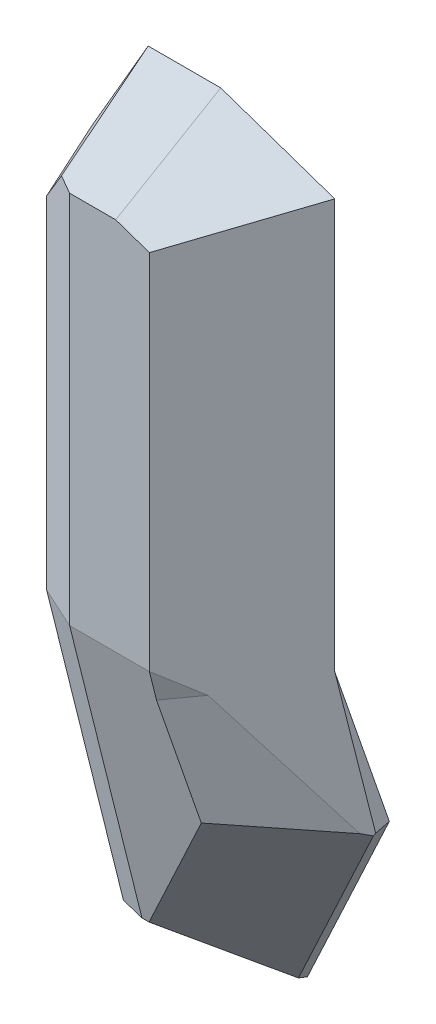
ISO-10303-21;
HEADER;
FILE_DESCRIPTION(('STEP AP214'),'2;1');
FILE_NAME('part.step','',(''),(''),'','','');
FILE_SCHEMA(('AUTOMOTIVE_DESIGN { 1 0 10303 214 1 1 1 1 }'));
ENDSEC;
DATA;
#1=APPLICATION_CONTEXT('core data for automotive mechanical design processes');
#2=APPLICATION_PROTOCOL_DEFINITION('international standard','automotive_design',2000,#1);
#3=PRODUCT_CONTEXT('',#1,'mechanical');
#4=PRODUCT('Part','Part','',(#3));
#5=PRODUCT_RELATED_PRODUCT_CATEGORY('part','',(#4));
#6=PRODUCT_DEFINITION_FORMATION('','',#4);
#7=PRODUCT_DEFINITION_CONTEXT('part definition',#1,'design');
#8=PRODUCT_DEFINITION('design','',#6,#7);
#9=PRODUCT_DEFINITION_SHAPE('','',#8);
#10=(LENGTH_UNIT() NAMED_UNIT(*) SI_UNIT(.MILLI.,.METRE.));
#11=(NAMED_UNIT(*) PLANE_ANGLE_UNIT() SI_UNIT($,.RADIAN.));
#12=(NAMED_UNIT(*) SI_UNIT($,.STERADIAN.) SOLID_ANGLE_UNIT());
#13=UNCERTAINTY_MEASURE_WITH_UNIT(LENGTH_MEASURE(1.E-05),#10,'distance_accuracy_value','');
#14=(GEOMETRIC_REPRESENTATION_CONTEXT(3) GLOBAL_UNCERTAINTY_ASSIGNED_CONTEXT((#13)) GLOBAL_UNIT_ASSIGNED_CONTEXT((#10,
#11,#12)) REPRESENTATION_CONTEXT('',''));
#15=CARTESIAN_POINT('',(0.,0.,0.));
#16=DIRECTION('',(0.,0.,1.));
#17=DIRECTION('',(1.,0.,0.));
#18=AXIS2_PLACEMENT_3D('',#15,#16,#17);
#19=CARTESIAN_POINT('',(0.,0.,10.));
#20=DIRECTION('',(0.,0.,1.));
#21=DIRECTION('',(1.,0.,0.));
#22=AXIS2_PLACEMENT_3D('',#19,#20,#21);
#23=PLANE('',#22);
#24=DIRECTION('',(-1.,0.,0.));
#25=VECTOR('',#24,1.);
#26=CARTESIAN_POINT('',(16.3625553019653,20.4199984097109,10.));
#27=LINE('',#26,#25);
#28=CARTESIAN_POINT('',(22.8583379716761,20.4199984097109,10.));
#29=VERTEX_POINT('',#28);
#30=CARTESIAN_POINT('',(17.8796509543944,20.4199984097109,10.));
#31=VERTEX_POINT('',#30);
#32=EDGE_CURVE('E214',#29,#31,#27,.T.);
#33=ORIENTED_EDGE('',*,*,#32,.T.);
#34=DIRECTION('',(0.,-1.,0.));
#35=VECTOR('',#34,1.);
#36=CARTESIAN_POINT('',(17.8796509543944,0.,10.));
#37=LINE('',#36,#35);
#38=CARTESIAN_POINT('',(17.8796509543944,-20.,10.));
#39=VERTEX_POINT('',#38);
#40=EDGE_CURVE('E205',#31,#39,#37,.T.);
#41=ORIENTED_EDGE('',*,*,#40,.T.);
#42=DIRECTION('',(1.,0.,0.));
#43=VECTOR('',#42,1.);
#44=CARTESIAN_POINT('',(0.,-20.,10.));
#45=LINE('',#44,#43);
#46=CARTESIAN_POINT('',(26.4999999999999,-20.,10.));
#47=VERTEX_POINT('',#46);
#48=EDGE_CURVE('E166',#39,#47,#45,.T.);
#49=ORIENTED_EDGE('',*,*,#48,.T.);
#50=DIRECTION('',(0.,1.,0.));
#51=VECTOR('',#50,1.);
#52=CARTESIAN_POINT('',(26.5,15.742857142857,10.));
#53=LINE('',#52,#51);
#54=CARTESIAN_POINT('',(26.5,19.1714285714285,10.));
#55=VERTEX_POINT('',#54);
#56=EDGE_CURVE('E176',#47,#55,#53,.T.);
#57=ORIENTED_EDGE('',*,*,#56,.T.);
#58=DIRECTION('',(-0.945945945945946,0.324324324324324,0.));
#59=VECTOR('',#58,1.);
#60=CARTESIAN_POINT('',(21.5970767104149,20.8524308421433,10.));
#61=LINE('',#60,#59);
#62=EDGE_CURVE('E418',#55,#29,#61,.T.);
#63=ORIENTED_EDGE('',*,*,#62,.T.);
#64=EDGE_LOOP('',(#33,#41,#49,#57,#63));
#65=FACE_BOUND('',#64,.T.);
#66=ADVANCED_FACE('F33',(#65),#23,.T.);
#67=CARTESIAN_POINT('',(0.,0.,0.));
#68=DIRECTION('',(0.,0.,1.));
#69=DIRECTION('',(1.,0.,0.));
#70=AXIS2_PLACEMENT_3D('',#67,#68,#69);
#71=PLANE('',#70);
#72=DIRECTION('',(1.,0.,0.));
#73=VECTOR('',#72,1.);
#74=CARTESIAN_POINT('',(0.,-20.,0.));
#75=LINE('',#74,#73);
#76=CARTESIAN_POINT('',(10.4089710823901,-20.,0.));
#77=VERTEX_POINT('',#76);
#78=CARTESIAN_POINT('',(36.5,-20.,0.));
#79=VERTEX_POINT('',#78);
#80=EDGE_CURVE('E136',#77,#79,#75,.T.);
#81=ORIENTED_EDGE('',*,*,#80,.F.);
#82=DIRECTION('',(-0.096560909917053,0.995327077234409,0.));
#83=VECTOR('',#82,1.);
#84=CARTESIAN_POINT('',(8.36563373946713,1.06223923410054,0.));
#85=LINE('',#84,#83);
#86=CARTESIAN_POINT('',(10.2895410829714,-18.7689437438234,0.));
#87=VERTEX_POINT('',#86);
#88=EDGE_CURVE('E191',#77,#87,#85,.T.);
#89=ORIENTED_EDGE('',*,*,#88,.T.);
#90=DIRECTION('',(0.,-1.,0.));
#91=VECTOR('',#90,1.);
#92=CARTESIAN_POINT('',(10.2895410829714,0.,0.));
#93=LINE('',#92,#91);
#94=CARTESIAN_POINT('',(10.2895410829714,17.9510749687993,0.));
#95=VERTEX_POINT('',#94);
#96=EDGE_CURVE('E149',#95,#87,#93,.T.);
#97=ORIENTED_EDGE('',*,*,#96,.F.);
#98=DIRECTION('',(-0.501782302817981,-0.864993942509821,0.));
#99=VECTOR('',#98,1.);
#100=CARTESIAN_POINT('',(-0.0926763401503869,0.053761471719066,0.));
#101=LINE('',#100,#99);
#102=CARTESIAN_POINT('',(16.3625553019653,28.4199984097109,0.));
#103=VERTEX_POINT('',#102);
#104=EDGE_CURVE('E243',#103,#95,#101,.T.);
#105=ORIENTED_EDGE('',*,*,#104,.F.);
#106=DIRECTION('',(-1.,0.,0.));
#107=VECTOR('',#106,1.);
#108=CARTESIAN_POINT('',(0.,28.4199984097109,0.));
#109=LINE('',#108,#107);
#110=CARTESIAN_POINT('',(24.1916713050095,28.4199984097109,0.));
#111=VERTEX_POINT('',#110);
#112=EDGE_CURVE('E247',#111,#103,#109,.T.);
#113=ORIENTED_EDGE('',*,*,#112,.F.);
#114=DIRECTION('',(-0.945945945945946,0.324324324324324,0.));
#115=VECTOR('',#114,1.);
#116=CARTESIAN_POINT('',(11.263696128561,32.8524470416361,0.));
#117=LINE('',#116,#115);
#118=CARTESIAN_POINT('',(36.5,24.1999999999999,0.));
#119=VERTEX_POINT('',#118);
#120=EDGE_CURVE('E164',#119,#111,#117,.T.);
#121=ORIENTED_EDGE('',*,*,#120,.F.);
#122=DIRECTION('',(0.,1.,0.));
#123=VECTOR('',#122,1.);
#124=CARTESIAN_POINT('',(36.5,0.,0.));
#125=LINE('',#124,#123);
#126=EDGE_CURVE('E148',#79,#119,#125,.T.);
#127=ORIENTED_EDGE('',*,*,#126,.F.);
#128=EDGE_LOOP('',(#81,#89,#97,#105,#113,#121,#127));
#129=FACE_BOUND('',#128,.T.);
#130=ADVANCED_FACE('F162',(#129),#71,.F.);
#131=CARTESIAN_POINT('',(38.711509495044,-20.,10.));
#132=DIRECTION('',(0.,-0.242535625036333,0.970142500145332));
#133=DIRECTION('',(0.,-0.970142500145332,-0.242535625036333));
#134=AXIS2_PLACEMENT_3D('',#131,#132,#133);
#135=PLANE('',#134);
#136=ORIENTED_EDGE('',*,*,#48,.F.);
#137=DIRECTION('',(0.,-0.970142500145332,-0.242535625036333));
#138=VECTOR('',#137,1.);
#139=CARTESIAN_POINT('',(17.8796509543944,-20.,10.));
#140=LINE('',#139,#138);
#141=CARTESIAN_POINT('',(17.8796509543944,-51.2541398446393,2.18646503884018));
#142=VERTEX_POINT('',#141);
#143=EDGE_CURVE('E193',#39,#142,#140,.T.);
#144=ORIENTED_EDGE('',*,*,#143,.T.);
#145=DIRECTION('',(-1.,0.,0.));
#146=VECTOR('',#145,1.);
#147=CARTESIAN_POINT('',(38.711509495044,-51.2541398446393,2.18646503884018));
#148=LINE('',#147,#146);
#149=CARTESIAN_POINT('',(18.6460740663521,-51.2541398446393,2.18646503884018));
#150=VERTEX_POINT('',#149);
#151=EDGE_CURVE('E237',#150,#142,#148,.T.);
#152=ORIENTED_EDGE('',*,*,#151,.F.);
#153=DIRECTION('',(0.503066169780382,0.838443616300638,0.209610904075159));
#154=VECTOR('',#153,1.);
#155=CARTESIAN_POINT('',(30.069030517213,-32.2158790932045,6.94603022669886));
#156=LINE('',#155,#154);
#157=CARTESIAN_POINT('',(28.3130965277123,-35.1424357423723,6.21439106440692));
#158=VERTEX_POINT('',#157);
#159=EDGE_CURVE('E414',#150,#158,#156,.T.);
#160=ORIENTED_EDGE('',*,*,#159,.T.);
#161=DIRECTION('',(-0.144004608221195,0.960030721474639,0.24000768036866));
#162=VECTOR('',#161,1.);
#163=CARTESIAN_POINT('',(26.6042298288053,-23.7499910829922,9.06250222925195));
#164=LINE('',#163,#162);
#165=CARTESIAN_POINT('',(26.4999999999999,-23.0551255576232,9.23621861059419));
#166=VERTEX_POINT('',#165);
#167=EDGE_CURVE('E412',#158,#166,#164,.T.);
#168=ORIENTED_EDGE('',*,*,#167,.T.);
#169=DIRECTION('',(0.,0.970142500145332,0.242535625036333));
#170=VECTOR('',#169,1.);
#171=CARTESIAN_POINT('',(26.4999999999999,-20.,10.));
#172=LINE('',#171,#170);
#173=EDGE_CURVE('E226',#166,#47,#172,.T.);
#174=ORIENTED_EDGE('',*,*,#173,.T.);
#175=EDGE_LOOP('',(#136,#144,#152,#160,#168,#174));
#176=FACE_BOUND('',#175,.T.);
#177=ADVANCED_FACE('F220',(#176),#135,.T.);
#178=CARTESIAN_POINT('',(38.711509495044,-60.,-10.));
#179=DIRECTION('',(0.,-0.812431002589345,0.583057343690714));
#180=DIRECTION('',(0.,-0.583057343690714,-0.812431002589345));
#181=AXIS2_PLACEMENT_3D('',#178,#179,#180);
#182=PLANE('',#181);
#183=ORIENTED_EDGE('',*,*,#151,.T.);
#184=DIRECTION('',(0.833595497575741,0.322066514389543,0.448766873477113));
#185=VECTOR('',#184,1.);
#186=CARTESIAN_POINT('',(25.4484588103233,-48.3298683348574,6.26113944307136));
#187=LINE('',#186,#185);
#188=CARTESIAN_POINT('',(13.5467597302632,-52.9281882024379,-0.146150784331431));
#189=VERTEX_POINT('',#188);
#190=EDGE_CURVE('E201',#142,#189,#187,.F.);
#191=ORIENTED_EDGE('',*,*,#190,.T.);
#192=DIRECTION('',(-0.250459024806615,-0.564473674042357,-0.786536552364887));
#193=VECTOR('',#192,1.);
#194=CARTESIAN_POINT('',(12.1843814802434,-55.9986571416899,-4.42453641094181));
#195=LINE('',#194,#193);
#196=CARTESIAN_POINT('',(10.4089710823901,-60.,-10.));
#197=VERTEX_POINT('',#196);
#198=EDGE_CURVE('E188',#189,#197,#195,.T.);
#199=ORIENTED_EDGE('',*,*,#198,.T.);
#200=DIRECTION('',(-1.,0.,0.));
#201=VECTOR('',#200,1.);
#202=CARTESIAN_POINT('',(38.711509495044,-60.,-10.));
#203=LINE('',#202,#201);
#204=CARTESIAN_POINT('',(23.55754747522,-60.,-10.));
#205=VERTEX_POINT('',#204);
#206=EDGE_CURVE('E430',#205,#197,#203,.T.);
#207=ORIENTED_EDGE('',*,*,#206,.F.);
#208=DIRECTION('',(-0.405762629335767,-0.532901873265707,-0.742544464732197));
#209=VECTOR('',#208,1.);
#210=CARTESIAN_POINT('',(26.0525459624705,-56.7232335569507,-5.43415982083954));
#211=LINE('',#210,#209);
#212=CARTESIAN_POINT('',(24.7254446492524,-58.4661608861259,-7.86275147276681));
#213=VERTEX_POINT('',#212);
#214=EDGE_CURVE('E432',#213,#205,#211,.T.);
#215=ORIENTED_EDGE('',*,*,#214,.F.);
#216=DIRECTION('',(-0.441091785473617,0.523271808270817,0.729125950338271));
#217=VECTOR('',#216,1.);
#218=CARTESIAN_POINT('',(28.4879912985251,-62.9297094120959,-14.0822515670553));
#219=LINE('',#218,#217);
#220=EDGE_CURVE('E407',#213,#150,#219,.T.);
#221=ORIENTED_EDGE('',*,*,#220,.T.);
#222=EDGE_LOOP('',(#183,#191,#199,#207,#215,#221));
#223=FACE_BOUND('',#222,.T.);
#224=ADVANCED_FACE('F235',(#223),#182,.T.);
#225=CARTESIAN_POINT('',(38.711509495044,-20.,0.));
#226=DIRECTION('',(0.,0.242535625036333,-0.970142500145332));
#227=DIRECTION('',(0.,0.970142500145332,0.242535625036333));
#228=AXIS2_PLACEMENT_3D('',#225,#226,#227);
#229=PLANE('',#228);
#230=ORIENTED_EDGE('',*,*,#206,.T.);
#231=DIRECTION('',(0.,0.970142500145332,0.242535625036333));
#232=VECTOR('',#231,1.);
#233=CARTESIAN_POINT('',(10.4089710823901,-20.,0.));
#234=LINE('',#233,#232);
#235=EDGE_CURVE('E144',#197,#77,#234,.T.);
#236=ORIENTED_EDGE('',*,*,#235,.T.);
#237=ORIENTED_EDGE('',*,*,#80,.T.);
#238=DIRECTION('',(-0.144004608221195,0.960030721474639,0.24000768036866));
#239=VECTOR('',#238,1.);
#240=CARTESIAN_POINT('',(32.9781105990783,3.47926267281104,5.86981566820276));
#241=LINE('',#240,#239);
#242=CARTESIAN_POINT('',(38.711509495044,-34.7433966336267,-3.68584915840669));
#243=VERTEX_POINT('',#242);
#244=EDGE_CURVE('E141',#243,#79,#241,.T.);
#245=ORIENTED_EDGE('',*,*,#244,.F.);
#246=DIRECTION('',(0.503066169780382,0.838443616300638,0.209610904075159));
#247=VECTOR('',#246,1.);
#248=CARTESIAN_POINT('',(43.9577463567109,-25.9996685308484,-1.49991713271212));
#249=LINE('',#248,#247);
#250=EDGE_CURVE('E157',#205,#243,#249,.T.);
#251=ORIENTED_EDGE('',*,*,#250,.F.);
#252=EDGE_LOOP('',(#230,#236,#237,#245,#251));
#253=FACE_BOUND('',#252,.T.);
#254=ADVANCED_FACE('F139',(#253),#229,.T.);
#255=CARTESIAN_POINT('',(43.9577463567109,-28.4250247812118,8.2015078687412));
#256=DIRECTION('',(-0.864247897783094,0.488045871689275,0.122011467922319));
#257=DIRECTION('',(-0.491719661409982,-0.870753567080177,0.));
#258=AXIS2_PLACEMENT_3D('',#255,#256,#257);
#259=PLANE('',#258);
#260=DIRECTION('',(0.,-0.242535625036333,0.970142500145332));
#261=VECTOR('',#260,1.);
#262=CARTESIAN_POINT('',(38.711509495044,-33.5669260453914,-8.39173151134784));
#263=LINE('',#262,#261);
#264=CARTESIAN_POINT('',(38.711509495044,-35.1119815494673,-2.21150949504404));
#265=VERTEX_POINT('',#264);
#266=EDGE_CURVE('E156',#243,#265,#263,.T.);
#267=ORIENTED_EDGE('',*,*,#266,.T.);
#268=DIRECTION('',(-0.405427964256693,-0.819302344435402,0.405427964256694));
#269=VECTOR('',#268,1.);
#270=CARTESIAN_POINT('',(46.3601326199036,-19.6553889846469,-9.86013261990365));
#271=LINE('',#270,#269);
#272=CARTESIAN_POINT('',(38.5870729952625,-35.363446976109,-2.08707299526258));
#273=VERTEX_POINT('',#272);
#274=EDGE_CURVE('E171',#265,#273,#271,.T.);
#275=ORIENTED_EDGE('',*,*,#274,.T.);
#276=DIRECTION('',(-0.503066169780382,-0.838443616300638,-0.209610904075159));
#277=VECTOR('',#276,1.);
#278=CARTESIAN_POINT('',(30.2168282743188,-49.3138548443486,-5.57467496232248));
#279=LINE('',#278,#277);
#280=EDGE_CURVE('E405',#273,#213,#279,.T.);
#281=ORIENTED_EDGE('',*,*,#280,.T.);
#282=ORIENTED_EDGE('',*,*,#214,.T.);
#283=ORIENTED_EDGE('',*,*,#250,.T.);
#284=EDGE_LOOP('',(#267,#275,#281,#282,#283));
#285=FACE_BOUND('',#284,.T.);
#286=ADVANCED_FACE('F357',(#285),#259,.F.);
#287=CARTESIAN_POINT('',(32.9781105990783,1.05390642244771,15.5712406696561));
#288=DIRECTION('',(-0.989577017119466,-0.139704990652159,-0.0349262476630398));
#289=DIRECTION('',(0.13979027774953,-0.990181134059173,0.));
#290=AXIS2_PLACEMENT_3D('',#287,#288,#289);
#291=PLANE('',#290);
#292=ORIENTED_EDGE('',*,*,#244,.T.);
#293=DIRECTION('',(0.143304653157729,-0.979248463244485,-0.143304653157729));
#294=VECTOR('',#293,1.);
#295=CARTESIAN_POINT('',(33.282658300057,1.98516828294352,3.21734169994292));
#296=LINE('',#295,#294);
#297=EDGE_CURVE('E154',#79,#265,#296,.T.);
#298=ORIENTED_EDGE('',*,*,#297,.T.);
#299=ORIENTED_EDGE('',*,*,#266,.F.);
#300=EDGE_LOOP('',(#292,#298,#299));
#301=FACE_BOUND('',#300,.T.);
#302=ADVANCED_FACE('F152',(#301),#291,.F.);
#303=CARTESIAN_POINT('',(36.5,0.763814412055373,6.94474235177851));
#304=DIRECTION('',(0.624695047554423,-0.189388504769643,0.757554019078571));
#305=DIRECTION('',(0.,0.970142500145332,0.242535625036333));
#306=AXIS2_PLACEMENT_3D('',#303,#304,#305);
#307=PLANE('',#306);
#308=DIRECTION('',(0.779624591261606,0.206013411142903,-0.591391554834392));
#309=VECTOR('',#308,1.);
#310=CARTESIAN_POINT('',(35.4240650457465,-20.6969686934839,2.46678526792994));
#311=LINE('',#310,#309);
#312=CARTESIAN_POINT('',(29.6634338202847,-22.2191978565908,6.83656617971526));
#313=VERTEX_POINT('',#312);
#314=EDGE_CURVE('E158',#313,#166,#311,.F.);
#315=ORIENTED_EDGE('',*,*,#314,.F.);
#316=DIRECTION('',(-0.633454136612263,0.444377895059624,0.633454136612265));
#317=VECTOR('',#316,1.);
#318=CARTESIAN_POINT('',(25.8937380350674,-19.5746978348388,10.6062619649326));
#319=LINE('',#318,#317);
#320=EDGE_CURVE('E183',#313,#47,#319,.T.);
#321=ORIENTED_EDGE('',*,*,#320,.T.);
#322=ORIENTED_EDGE('',*,*,#173,.F.);
#323=EDGE_LOOP('',(#315,#321,#322));
#324=FACE_BOUND('',#323,.T.);
#325=ADVANCED_FACE('F275',(#324),#307,.T.);
#326=CARTESIAN_POINT('',(32.9781105990783,3.06660649663112,7.52044037292244));
#327=DIRECTION('',(0.618183861768209,-0.102115488990602,0.779372273023331));
#328=DIRECTION('',(-0.144004608221195,0.960030721474639,0.24000768036866));
#329=AXIS2_PLACEMENT_3D('',#326,#327,#328);
#330=PLANE('',#329);
#331=DIRECTION('',(0.783401951992458,-0.00102589089719062,-0.621514544610401));
#332=VECTOR('',#331,1.);
#333=CARTESIAN_POINT('',(30.5094846848295,-35.1453119856742,4.47187921364305));
#334=LINE('',#333,#332);
#335=CARTESIAN_POINT('',(37.8584348319835,-35.1549356801783,-1.35843483198354));
#336=VERTEX_POINT('',#335);
#337=EDGE_CURVE('E420',#336,#158,#334,.F.);
#338=ORIENTED_EDGE('',*,*,#337,.F.);
#339=DIRECTION('',(-0.471843287766038,0.74480052603383,0.471843287766039));
#340=VECTOR('',#339,1.);
#341=CARTESIAN_POINT('',(21.3629772185519,-9.11699930130058,15.1370227814481));
#342=LINE('',#341,#340);
#343=EDGE_CURVE('E181',#336,#313,#342,.T.);
#344=ORIENTED_EDGE('',*,*,#343,.T.);
#345=ORIENTED_EDGE('',*,*,#314,.T.);
#346=ORIENTED_EDGE('',*,*,#167,.F.);
#347=EDGE_LOOP('',(#338,#344,#345,#346));
#348=FACE_BOUND('',#347,.T.);
#349=ADVANCED_FACE('F271',(#348),#330,.T.);
#350=CARTESIAN_POINT('',(43.9577463567109,-26.4123247070284,0.150707572007573));
#351=DIRECTION('',(0.53989138160442,-0.494268343793314,0.681334059322653));
#352=DIRECTION('',(0.503066169780382,0.838443616300638,0.209610904075159));
#353=AXIS2_PLACEMENT_3D('',#350,#351,#352);
#354=PLANE('',#353);
#355=ORIENTED_EDGE('',*,*,#280,.F.);
#356=DIRECTION('',(-0.69306030029259,0.198330129624041,0.693060300292591));
#357=VECTOR('',#356,1.);
#358=CARTESIAN_POINT('',(38.8615292964646,-35.441986972947,-2.36152929646471));
#359=LINE('',#358,#357);
#360=EDGE_CURVE('E174',#273,#336,#359,.T.);
#361=ORIENTED_EDGE('',*,*,#360,.T.);
#362=ORIENTED_EDGE('',*,*,#337,.T.);
#363=ORIENTED_EDGE('',*,*,#159,.F.);
#364=ORIENTED_EDGE('',*,*,#220,.F.);
#365=EDGE_LOOP('',(#355,#361,#362,#363,#364));
#366=FACE_BOUND('',#365,.T.);
#367=ADVANCED_FACE('F267',(#366),#354,.T.);
#368=CARTESIAN_POINT('',(0.,20.4199984097109,10.));
#369=DIRECTION('',(0.,0.78086880944303,0.624695047554424));
#370=DIRECTION('',(1.,0.,0.));
#371=AXIS2_PLACEMENT_3D('',#368,#369,#370);
#372=PLANE('',#371);
#373=DIRECTION('',(-0.00128717065701618,-0.62469453005424,0.7808681625678));
#374=VECTOR('',#373,1.);
#375=CARTESIAN_POINT('',(16.3460443787399,20.4068547221408,10.0164296094626));
#376=LINE('',#375,#374);
#377=CARTESIAN_POINT('',(16.347154093952,20.9454259047197,9.34321563123899));
#378=VERTEX_POINT('',#377);
#379=EDGE_CURVE('E186',#103,#378,#376,.T.);
#380=ORIENTED_EDGE('',*,*,#379,.T.);
#381=DIRECTION('',(-0.876645253724841,0.300564086991377,-0.375705108739221));
#382=VECTOR('',#381,1.);
#383=CARTESIAN_POINT('',(4.13901581064719,25.1310733161386,4.11115636696545));
#384=LINE('',#383,#382);
#385=EDGE_CURVE('E11',#378,#31,#384,.F.);
#386=ORIENTED_EDGE('',*,*,#385,.T.);
#387=ORIENTED_EDGE('',*,*,#32,.F.);
#388=DIRECTION('',(0.1035560746157,0.621336447694197,-0.776670559617747));
#389=VECTOR('',#388,1.);
#390=CARTESIAN_POINT('',(22.613208341953,18.9492206313725,11.838472222923));
#391=LINE('',#390,#389);
#392=EDGE_CURVE('E198',#111,#29,#391,.F.);
#393=ORIENTED_EDGE('',*,*,#392,.F.);
#394=ORIENTED_EDGE('',*,*,#112,.T.);
#395=EDGE_LOOP('',(#380,#386,#387,#393,#394));
#396=FACE_BOUND('',#395,.T.);
#397=ADVANCED_FACE('F270',(#396),#372,.T.);
#398=CARTESIAN_POINT('',(8.66910153396635,25.2848794740685,10.));
#399=DIRECTION('',(0.25325474900855,0.738659684608272,0.624695047554424));
#400=DIRECTION('',(0.945945945945946,-0.324324324324324,0.));
#401=AXIS2_PLACEMENT_3D('',#398,#399,#400);
#402=PLANE('',#401);
#403=ORIENTED_EDGE('',*,*,#62,.F.);
#404=DIRECTION('',(0.666242581872043,0.335024841169943,-0.666242581872045));
#405=VECTOR('',#404,1.);
#406=CARTESIAN_POINT('',(19.9498054668287,15.8776164633194,16.5501945331713));
#407=LINE('',#406,#405);
#408=EDGE_CURVE('E172',#55,#119,#407,.T.);
#409=ORIENTED_EDGE('',*,*,#408,.T.);
#410=ORIENTED_EDGE('',*,*,#120,.T.);
#411=ORIENTED_EDGE('',*,*,#392,.T.);
#412=EDGE_LOOP('',(#403,#409,#410,#411));
#413=FACE_BOUND('',#412,.T.);
#414=ADVANCED_FACE('F280',(#413),#402,.T.);
#415=CARTESIAN_POINT('',(26.5,0.,10.));
#416=DIRECTION('',(0.707106781186549,0.,0.707106781186547));
#417=DIRECTION('',(0.,-1.,0.));
#418=AXIS2_PLACEMENT_3D('',#415,#416,#417);
#419=PLANE('',#418);
#420=ORIENTED_EDGE('',*,*,#297,.F.);
#421=ORIENTED_EDGE('',*,*,#126,.T.);
#422=ORIENTED_EDGE('',*,*,#408,.F.);
#423=ORIENTED_EDGE('',*,*,#56,.F.);
#424=ORIENTED_EDGE('',*,*,#320,.F.);
#425=ORIENTED_EDGE('',*,*,#343,.F.);
#426=ORIENTED_EDGE('',*,*,#360,.F.);
#427=ORIENTED_EDGE('',*,*,#274,.F.);
#428=EDGE_LOOP('',(#420,#421,#422,#423,#424,#425,#426,#427));
#429=FACE_BOUND('',#428,.T.);
#430=ADVANCED_FACE('F169',(#429),#419,.T.);
#431=CARTESIAN_POINT('',(10.2895410829714,1.24888566212805,5.00445735148778));
#432=DIRECTION('',(-0.92847669088526,-0.0900754698222086,0.360301879288834));
#433=DIRECTION('',(0.,-0.970142500145332,-0.242535625036333));
#434=AXIS2_PLACEMENT_3D('',#431,#432,#433);
#435=PLANE('',#434);
#436=ORIENTED_EDGE('',*,*,#198,.F.);
#437=DIRECTION('',(0.,0.970142500145332,0.242535625036333));
#438=VECTOR('',#437,1.);
#439=CARTESIAN_POINT('',(13.5467597302632,-0.726093239124246,12.904372956497));
#440=LINE('',#439,#438);
#441=CARTESIAN_POINT('',(13.5467597302632,-19.7713985921943,8.14304661822947));
#442=VERTEX_POINT('',#441);
#443=EDGE_CURVE('E203',#189,#442,#440,.T.);
#444=ORIENTED_EDGE('',*,*,#443,.T.);
#445=DIRECTION('',(0.368988147273833,-0.113561291789115,0.922470368184589));
#446=VECTOR('',#445,1.);
#447=CARTESIAN_POINT('',(13.4514856697856,-19.7420766601437,7.90486146703554));
#448=LINE('',#447,#446);
#449=EDGE_CURVE('E196',#87,#442,#448,.T.);
#450=ORIENTED_EDGE('',*,*,#449,.F.);
#451=ORIENTED_EDGE('',*,*,#88,.F.);
#452=ORIENTED_EDGE('',*,*,#235,.F.);
#453=EDGE_LOOP('',(#436,#444,#450,#451,#452));
#454=FACE_BOUND('',#453,.T.);
#455=ADVANCED_FACE('F239',(#454),#435,.T.);
#456=CARTESIAN_POINT('',(14.2895410829714,0.,10.));
#457=DIRECTION('',(-0.92847669088526,0.,0.371390676354102));
#458=DIRECTION('',(0.,1.,0.));
#459=AXIS2_PLACEMENT_3D('',#456,#457,#458);
#460=PLANE('',#459);
#461=ORIENTED_EDGE('',*,*,#449,.T.);
#462=DIRECTION('',(0.,1.,0.));
#463=VECTOR('',#462,1.);
#464=CARTESIAN_POINT('',(13.5467597302632,0.,8.14304661822947));
#465=LINE('',#464,#463);
#466=CARTESIAN_POINT('',(13.5467597302632,17.074710367089,8.14304661822947));
#467=VERTEX_POINT('',#466);
#468=EDGE_CURVE('E56',#442,#467,#465,.T.);
#469=ORIENTED_EDGE('',*,*,#468,.T.);
#470=DIRECTION('',(-0.369550322362978,0.0994286402415191,-0.923875805907451));
#471=VECTOR('',#470,1.);
#472=CARTESIAN_POINT('',(14.9095891181592,16.7080369677715,11.5501200879697));
#473=LINE('',#472,#471);
#474=EDGE_CURVE('E194',#95,#467,#473,.F.);
#475=ORIENTED_EDGE('',*,*,#474,.F.);
#476=ORIENTED_EDGE('',*,*,#96,.T.);
#477=EDGE_LOOP('',(#461,#469,#475,#476));
#478=FACE_BOUND('',#477,.T.);
#479=ADVANCED_FACE('F249',(#478),#460,.T.);
#480=CARTESIAN_POINT('',(3.3672994298889,-1.95336773955286,10.));
#481=DIRECTION('',(-0.803126713377314,0.465893172065225,0.371390676354101));
#482=DIRECTION('',(0.501782302817981,0.864993942509821,0.));
#483=AXIS2_PLACEMENT_3D('',#480,#481,#482);
#484=PLANE('',#483);
#485=ORIENTED_EDGE('',*,*,#474,.T.);
#486=DIRECTION('',(-0.568497517465147,-0.785779389677898,-0.243641793199351));
#487=VECTOR('',#486,1.);
#488=CARTESIAN_POINT('',(2.01397005525195,1.13404544999114,3.20042247179605));
#489=LINE('',#488,#487);
#490=EDGE_CURVE('E42',#467,#378,#489,.F.);
#491=ORIENTED_EDGE('',*,*,#490,.T.);
#492=ORIENTED_EDGE('',*,*,#379,.F.);
#493=ORIENTED_EDGE('',*,*,#104,.T.);
#494=EDGE_LOOP('',(#485,#491,#492,#493));
#495=FACE_BOUND('',#494,.T.);
#496=ADVANCED_FACE('F246',(#495),#484,.T.);
#497=CARTESIAN_POINT('',(17.8796509543944,0.,10.));
#498=DIRECTION('',(0.393919298579171,0.,-0.919145030018056));
#499=DIRECTION('',(0.,-1.,0.));
#500=AXIS2_PLACEMENT_3D('',#497,#498,#499);
#501=PLANE('',#500);
#502=ORIENTED_EDGE('',*,*,#490,.F.);
#503=ORIENTED_EDGE('',*,*,#468,.F.);
#504=DIRECTION('',(0.91806618462931,-0.0484367622930887,0.393456936269708));
#505=VECTOR('',#504,1.);
#506=CARTESIAN_POINT('',(16.9902878833101,-19.9530776011712,9.61884439810675));
#507=LINE('',#506,#505);
#508=EDGE_CURVE('E37',#39,#442,#507,.F.);
#509=ORIENTED_EDGE('',*,*,#508,.F.);
#510=ORIENTED_EDGE('',*,*,#40,.F.);
#511=ORIENTED_EDGE('',*,*,#385,.F.);
#512=EDGE_LOOP('',(#502,#503,#509,#510,#511));
#513=FACE_BOUND('',#512,.T.);
#514=ADVANCED_FACE('F35',(#513),#501,.F.);
#515=CARTESIAN_POINT('',(17.8796509543944,-20.,10.));
#516=DIRECTION('',(0.39391929857917,0.222925414354468,-0.891701657417874));
#517=DIRECTION('',(0.,-0.970142500145332,-0.242535625036333));
#518=AXIS2_PLACEMENT_3D('',#515,#516,#517);
#519=PLANE('',#518);
#520=ORIENTED_EDGE('',*,*,#508,.T.);
#521=ORIENTED_EDGE('',*,*,#443,.F.);
#522=ORIENTED_EDGE('',*,*,#190,.F.);
#523=ORIENTED_EDGE('',*,*,#143,.F.);
#524=EDGE_LOOP('',(#520,#521,#522,#523));
#525=FACE_BOUND('',#524,.T.);
#526=ADVANCED_FACE('F232',(#525),#519,.F.);
#527=CLOSED_SHELL('',(#66,#130,#177,#224,#254,#286,#302,#325,#349,#367,#397,#414,#430,#455,#479,
#496,#514,#526));
#528=MANIFOLD_SOLID_BREP('B2',#527);
#529=ADVANCED_BREP_SHAPE_REPRESENTATION('',(#18,#528),#14);
#530=SHAPE_DEFINITION_REPRESENTATION(#9,#529);
ENDSEC;
END-ISO-10303-21;
